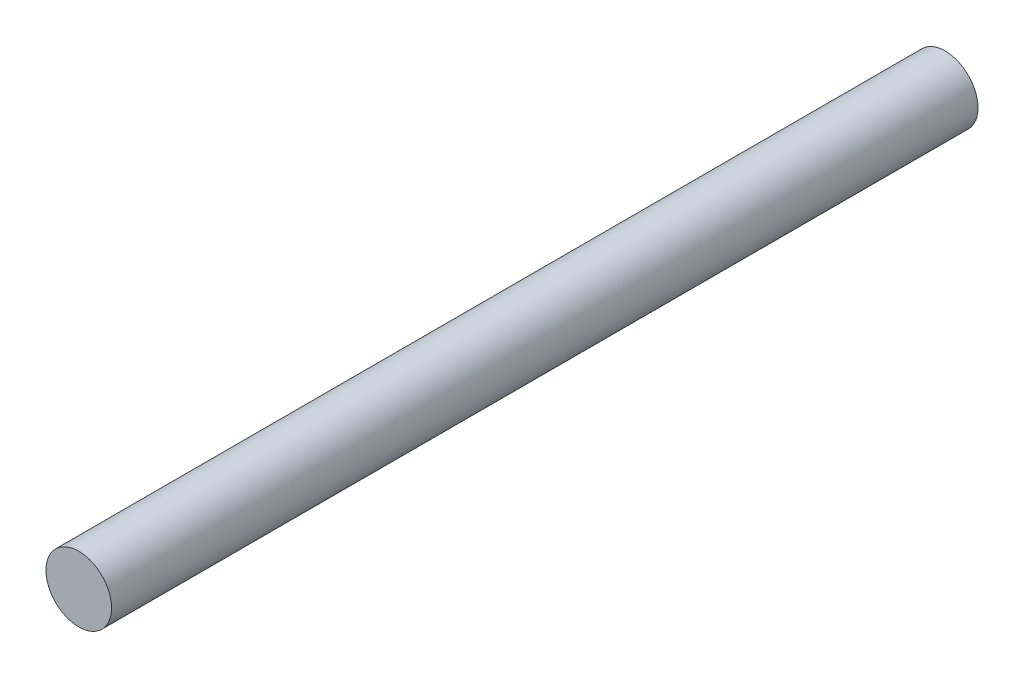
ISO-10303-21;
HEADER;
FILE_DESCRIPTION(('STEP AP214'),'2;1');
FILE_NAME('part.step','',(''),(''),'','','');
FILE_SCHEMA(('AUTOMOTIVE_DESIGN { 1 0 10303 214 1 1 1 1 }'));
ENDSEC;
DATA;
#1=APPLICATION_CONTEXT('core data for automotive mechanical design processes');
#2=APPLICATION_PROTOCOL_DEFINITION('international standard','automotive_design',2000,#1);
#3=PRODUCT_CONTEXT('',#1,'mechanical');
#4=PRODUCT('Part','Part','',(#3));
#5=PRODUCT_RELATED_PRODUCT_CATEGORY('part','',(#4));
#6=PRODUCT_DEFINITION_FORMATION('','',#4);
#7=PRODUCT_DEFINITION_CONTEXT('part definition',#1,'design');
#8=PRODUCT_DEFINITION('design','',#6,#7);
#9=PRODUCT_DEFINITION_SHAPE('','',#8);
#10=(LENGTH_UNIT() NAMED_UNIT(*) SI_UNIT(.MILLI.,.METRE.));
#11=(NAMED_UNIT(*) PLANE_ANGLE_UNIT() SI_UNIT($,.RADIAN.));
#12=(NAMED_UNIT(*) SI_UNIT($,.STERADIAN.) SOLID_ANGLE_UNIT());
#13=UNCERTAINTY_MEASURE_WITH_UNIT(LENGTH_MEASURE(1.E-05),#10,'distance_accuracy_value','');
#14=(GEOMETRIC_REPRESENTATION_CONTEXT(3) GLOBAL_UNCERTAINTY_ASSIGNED_CONTEXT((#13)) GLOBAL_UNIT_ASSIGNED_CONTEXT((#10,
#11,#12)) REPRESENTATION_CONTEXT('',''));
#15=CARTESIAN_POINT('',(0.,0.,0.));
#16=DIRECTION('',(0.,0.,1.));
#17=DIRECTION('',(1.,0.,0.));
#18=AXIS2_PLACEMENT_3D('',#15,#16,#17);
#19=CARTESIAN_POINT('',(0.,0.,66.));
#20=DIRECTION('',(0.,0.,-1.));
#21=DIRECTION('',(-1.,0.,0.));
#22=AXIS2_PLACEMENT_3D('',#19,#20,#21);
#23=CYLINDRICAL_SURFACE('',#22,2.5);
#24=CARTESIAN_POINT('',(0.,0.,66.));
#25=DIRECTION('',(0.,0.,1.));
#26=DIRECTION('',(1.,0.,0.));
#27=AXIS2_PLACEMENT_3D('',#24,#25,#26);
#28=CIRCLE('',#27,2.5);
#29=CARTESIAN_POINT('',(2.5,0.,66.));
#30=VERTEX_POINT('',#29);
#31=EDGE_CURVE('E10',#30,#30,#28,.T.);
#32=ORIENTED_EDGE('',*,*,#31,.F.);
#33=EDGE_LOOP('',(#32));
#34=FACE_BOUND('',#33,.T.);
#35=CARTESIAN_POINT('',(0.,0.,0.));
#36=DIRECTION('',(0.,0.,1.));
#37=DIRECTION('',(1.,0.,0.));
#38=AXIS2_PLACEMENT_3D('',#35,#36,#37);
#39=CIRCLE('',#38,2.5);
#40=CARTESIAN_POINT('',(2.5,0.,0.));
#41=VERTEX_POINT('',#40);
#42=EDGE_CURVE('E38',#41,#41,#39,.T.);
#43=ORIENTED_EDGE('',*,*,#42,.T.);
#44=EDGE_LOOP('',(#43));
#45=FACE_BOUND('',#44,.T.);
#46=ADVANCED_FACE('F35',(#34,#45),#23,.T.);
#47=CARTESIAN_POINT('',(0.,0.,66.));
#48=DIRECTION('',(0.,0.,1.));
#49=DIRECTION('',(1.,0.,0.));
#50=AXIS2_PLACEMENT_3D('',#47,#48,#49);
#51=PLANE('',#50);
#52=ORIENTED_EDGE('',*,*,#31,.T.);
#53=EDGE_LOOP('',(#52));
#54=FACE_BOUND('',#53,.T.);
#55=ADVANCED_FACE('F50',(#54),#51,.T.);
#56=CARTESIAN_POINT('',(0.,0.,0.));
#57=DIRECTION('',(0.,0.,1.));
#58=DIRECTION('',(1.,0.,0.));
#59=AXIS2_PLACEMENT_3D('',#56,#57,#58);
#60=PLANE('',#59);
#61=ORIENTED_EDGE('',*,*,#42,.F.);
#62=EDGE_LOOP('',(#61));
#63=FACE_BOUND('',#62,.T.);
#64=ADVANCED_FACE('F48',(#63),#60,.F.);
#65=CLOSED_SHELL('',(#46,#55,#64));
#66=MANIFOLD_SOLID_BREP('B2',#65);
#67=ADVANCED_BREP_SHAPE_REPRESENTATION('',(#18,#66),#14);
#68=SHAPE_DEFINITION_REPRESENTATION(#9,#67);
ENDSEC;
END-ISO-10303-21;
